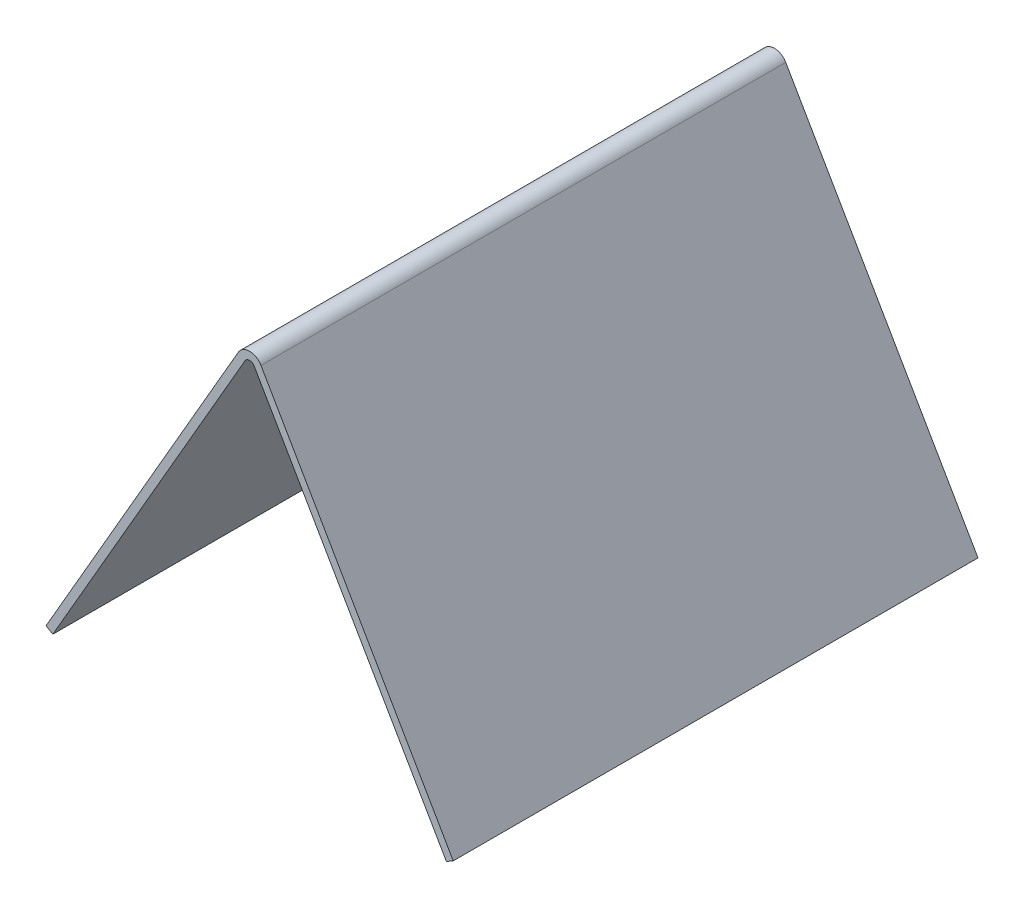
ISO-10303-21;
HEADER;
FILE_DESCRIPTION(('STEP AP214'),'2;1');
FILE_NAME('part.step','',(''),(''),'','','');
FILE_SCHEMA(('AUTOMOTIVE_DESIGN { 1 0 10303 214 1 1 1 1 }'));
ENDSEC;
DATA;
#1=APPLICATION_CONTEXT('core data for automotive mechanical design processes');
#2=APPLICATION_PROTOCOL_DEFINITION('international standard','automotive_design',2000,#1);
#3=PRODUCT_CONTEXT('',#1,'mechanical');
#4=PRODUCT('Part','Part','',(#3));
#5=PRODUCT_RELATED_PRODUCT_CATEGORY('part','',(#4));
#6=PRODUCT_DEFINITION_FORMATION('','',#4);
#7=PRODUCT_DEFINITION_CONTEXT('part definition',#1,'design');
#8=PRODUCT_DEFINITION('design','',#6,#7);
#9=PRODUCT_DEFINITION_SHAPE('','',#8);
#10=(LENGTH_UNIT() NAMED_UNIT(*) SI_UNIT(.MILLI.,.METRE.));
#11=(NAMED_UNIT(*) PLANE_ANGLE_UNIT() SI_UNIT($,.RADIAN.));
#12=(NAMED_UNIT(*) SI_UNIT($,.STERADIAN.) SOLID_ANGLE_UNIT());
#13=UNCERTAINTY_MEASURE_WITH_UNIT(LENGTH_MEASURE(1.E-05),#10,'distance_accuracy_value','');
#14=(GEOMETRIC_REPRESENTATION_CONTEXT(3) GLOBAL_UNCERTAINTY_ASSIGNED_CONTEXT((#13)) GLOBAL_UNIT_ASSIGNED_CONTEXT((#10,
#11,#12)) REPRESENTATION_CONTEXT('',''));
#15=CARTESIAN_POINT('',(0.,0.,0.));
#16=DIRECTION('',(0.,0.,1.));
#17=DIRECTION('',(1.,0.,0.));
#18=AXIS2_PLACEMENT_3D('',#15,#16,#17);
#19=CARTESIAN_POINT('',(-75.,0.,200.));
#20=DIRECTION('',(0.500000000000005,0.866025403784436,0.));
#21=DIRECTION('',(-0.866025403784436,0.500000000000005,0.));
#22=AXIS2_PLACEMENT_3D('',#19,#20,#21);
#23=PLANE('',#22);
#24=DIRECTION('',(0.866025403784436,-0.500000000000005,0.));
#25=VECTOR('',#24,1.);
#26=CARTESIAN_POINT('',(-75.,0.,0.));
#27=LINE('',#26,#25);
#28=CARTESIAN_POINT('',(-77.5980762113532,1.49999999999998,0.));
#29=VERTEX_POINT('',#28);
#30=CARTESIAN_POINT('',(-75.,0.,0.));
#31=VERTEX_POINT('',#30);
#32=EDGE_CURVE('E128',#29,#31,#27,.T.);
#33=ORIENTED_EDGE('',*,*,#32,.T.);
#34=DIRECTION('',(0.,0.,-1.));
#35=VECTOR('',#34,1.);
#36=CARTESIAN_POINT('',(-75.,0.,200.));
#37=LINE('',#36,#35);
#38=CARTESIAN_POINT('',(-75.,0.,200.));
#39=VERTEX_POINT('',#38);
#40=EDGE_CURVE('E11',#39,#31,#37,.T.);
#41=ORIENTED_EDGE('',*,*,#40,.F.);
#42=DIRECTION('',(0.866025403784436,-0.500000000000005,0.));
#43=VECTOR('',#42,1.);
#44=CARTESIAN_POINT('',(-75.,0.,200.));
#45=LINE('',#44,#43);
#46=CARTESIAN_POINT('',(-77.5980762113532,1.49999999999998,200.));
#47=VERTEX_POINT('',#46);
#48=EDGE_CURVE('E142',#47,#39,#45,.T.);
#49=ORIENTED_EDGE('',*,*,#48,.F.);
#50=DIRECTION('',(0.,0.,-1.));
#51=VECTOR('',#50,1.);
#52=CARTESIAN_POINT('',(-77.5980762113532,1.49999999999998,200.));
#53=LINE('',#52,#51);
#54=EDGE_CURVE('E124',#47,#29,#53,.T.);
#55=ORIENTED_EDGE('',*,*,#54,.T.);
#56=EDGE_LOOP('',(#33,#41,#49,#55));
#57=FACE_BOUND('',#56,.T.);
#58=ADVANCED_FACE('F32',(#57),#23,.F.);
#59=CARTESIAN_POINT('',(-1.73205080756889,126.903810567665,200.));
#60=DIRECTION('',(-0.866025403784438,0.500000000000001,0.));
#61=DIRECTION('',(-0.500000000000001,-0.866025403784438,0.));
#62=AXIS2_PLACEMENT_3D('',#59,#60,#61);
#63=PLANE('',#62);
#64=DIRECTION('',(0.500000000000001,0.866025403784438,0.));
#65=VECTOR('',#64,1.);
#66=CARTESIAN_POINT('',(-1.73205080756889,126.903810567665,0.));
#67=LINE('',#66,#65);
#68=CARTESIAN_POINT('',(-1.73205080756889,126.903810567665,0.));
#69=VERTEX_POINT('',#68);
#70=EDGE_CURVE('E131',#31,#69,#67,.T.);
#71=ORIENTED_EDGE('',*,*,#70,.T.);
#72=DIRECTION('',(0.,0.,-1.));
#73=VECTOR('',#72,1.);
#74=CARTESIAN_POINT('',(-1.73205080756889,126.903810567665,200.));
#75=LINE('',#74,#73);
#76=CARTESIAN_POINT('',(-1.73205080756889,126.903810567665,200.));
#77=VERTEX_POINT('',#76);
#78=EDGE_CURVE('E40',#77,#69,#75,.T.);
#79=ORIENTED_EDGE('',*,*,#78,.F.);
#80=DIRECTION('',(0.500000000000001,0.866025403784438,0.));
#81=VECTOR('',#80,1.);
#82=CARTESIAN_POINT('',(-1.73205080756889,126.903810567665,200.));
#83=LINE('',#82,#81);
#84=EDGE_CURVE('E91',#39,#77,#83,.T.);
#85=ORIENTED_EDGE('',*,*,#84,.F.);
#86=ORIENTED_EDGE('',*,*,#40,.T.);
#87=EDGE_LOOP('',(#71,#79,#85,#86));
#88=FACE_BOUND('',#87,.T.);
#89=ADVANCED_FACE('F177',(#88),#63,.F.);
#90=CARTESIAN_POINT('',(0.,125.903810567665,200.));
#91=DIRECTION('',(0.,0.,-1.));
#92=DIRECTION('',(-1.,0.,0.));
#93=AXIS2_PLACEMENT_3D('',#90,#91,#92);
#94=CYLINDRICAL_SURFACE('',#93,2.);
#95=CARTESIAN_POINT('',(0.,125.903810567665,0.));
#96=DIRECTION('',(0.,0.,-1.));
#97=DIRECTION('',(1.,0.,0.));
#98=AXIS2_PLACEMENT_3D('',#95,#96,#97);
#99=CIRCLE('',#98,2.);
#100=CARTESIAN_POINT('',(1.73205080756889,126.903810567665,0.));
#101=VERTEX_POINT('',#100);
#102=EDGE_CURVE('E133',#69,#101,#99,.T.);
#103=ORIENTED_EDGE('',*,*,#102,.T.);
#104=DIRECTION('',(0.,0.,-1.));
#105=VECTOR('',#104,1.);
#106=CARTESIAN_POINT('',(1.73205080756889,126.903810567665,200.));
#107=LINE('',#106,#105);
#108=CARTESIAN_POINT('',(1.73205080756889,126.903810567665,200.));
#109=VERTEX_POINT('',#108);
#110=EDGE_CURVE('E149',#109,#101,#107,.T.);
#111=ORIENTED_EDGE('',*,*,#110,.F.);
#112=CARTESIAN_POINT('',(0.,125.903810567665,200.));
#113=DIRECTION('',(0.,0.,-1.));
#114=DIRECTION('',(1.,0.,0.));
#115=AXIS2_PLACEMENT_3D('',#112,#113,#114);
#116=CIRCLE('',#115,2.);
#117=EDGE_CURVE('E157',#77,#109,#116,.T.);
#118=ORIENTED_EDGE('',*,*,#117,.F.);
#119=ORIENTED_EDGE('',*,*,#78,.T.);
#120=EDGE_LOOP('',(#103,#111,#118,#119));
#121=FACE_BOUND('',#120,.T.);
#122=ADVANCED_FACE('F155',(#121),#94,.F.);
#123=CARTESIAN_POINT('',(1.73205080756889,126.903810567665,200.));
#124=DIRECTION('',(0.866025403784438,0.500000000000001,0.));
#125=DIRECTION('',(-0.500000000000001,0.866025403784438,0.));
#126=AXIS2_PLACEMENT_3D('',#123,#124,#125);
#127=PLANE('',#126);
#128=DIRECTION('',(0.500000000000001,-0.866025403784438,0.));
#129=VECTOR('',#128,1.);
#130=CARTESIAN_POINT('',(1.73205080756889,126.903810567665,0.));
#131=LINE('',#130,#129);
#132=CARTESIAN_POINT('',(75.,0.,0.));
#133=VERTEX_POINT('',#132);
#134=EDGE_CURVE('E135',#101,#133,#131,.T.);
#135=ORIENTED_EDGE('',*,*,#134,.T.);
#136=DIRECTION('',(0.,0.,-1.));
#137=VECTOR('',#136,1.);
#138=CARTESIAN_POINT('',(75.,0.,200.));
#139=LINE('',#138,#137);
#140=CARTESIAN_POINT('',(75.,0.,200.));
#141=VERTEX_POINT('',#140);
#142=EDGE_CURVE('E146',#141,#133,#139,.T.);
#143=ORIENTED_EDGE('',*,*,#142,.F.);
#144=DIRECTION('',(0.500000000000001,-0.866025403784438,0.));
#145=VECTOR('',#144,1.);
#146=CARTESIAN_POINT('',(1.73205080756889,126.903810567665,200.));
#147=LINE('',#146,#145);
#148=EDGE_CURVE('E169',#109,#141,#147,.T.);
#149=ORIENTED_EDGE('',*,*,#148,.F.);
#150=ORIENTED_EDGE('',*,*,#110,.T.);
#151=EDGE_LOOP('',(#135,#143,#149,#150));
#152=FACE_BOUND('',#151,.T.);
#153=ADVANCED_FACE('F165',(#152),#127,.F.);
#154=CARTESIAN_POINT('',(75.,0.,200.));
#155=DIRECTION('',(-0.500000000000005,0.866025403784436,0.));
#156=DIRECTION('',(-0.866025403784436,-0.500000000000005,0.));
#157=AXIS2_PLACEMENT_3D('',#154,#155,#156);
#158=PLANE('',#157);
#159=DIRECTION('',(0.866025403784436,0.500000000000005,0.));
#160=VECTOR('',#159,1.);
#161=CARTESIAN_POINT('',(75.,0.,0.));
#162=LINE('',#161,#160);
#163=CARTESIAN_POINT('',(77.5980762113533,1.5,0.));
#164=VERTEX_POINT('',#163);
#165=EDGE_CURVE('E137',#133,#164,#162,.T.);
#166=ORIENTED_EDGE('',*,*,#165,.T.);
#167=DIRECTION('',(0.,0.,-1.));
#168=VECTOR('',#167,1.);
#169=CARTESIAN_POINT('',(77.5980762113533,1.5,200.));
#170=LINE('',#169,#168);
#171=CARTESIAN_POINT('',(77.5980762113533,1.5,200.));
#172=VERTEX_POINT('',#171);
#173=EDGE_CURVE('E119',#172,#164,#170,.T.);
#174=ORIENTED_EDGE('',*,*,#173,.F.);
#175=DIRECTION('',(0.866025403784436,0.500000000000005,0.));
#176=VECTOR('',#175,1.);
#177=CARTESIAN_POINT('',(75.,0.,200.));
#178=LINE('',#177,#176);
#179=EDGE_CURVE('E110',#141,#172,#178,.T.);
#180=ORIENTED_EDGE('',*,*,#179,.F.);
#181=ORIENTED_EDGE('',*,*,#142,.T.);
#182=EDGE_LOOP('',(#166,#174,#180,#181));
#183=FACE_BOUND('',#182,.T.);
#184=ADVANCED_FACE('F168',(#183),#158,.F.);
#185=CARTESIAN_POINT('',(77.5980762113533,1.5,200.));
#186=DIRECTION('',(-0.866025403784438,-0.500000000000001,0.));
#187=DIRECTION('',(0.500000000000001,-0.866025403784438,0.));
#188=AXIS2_PLACEMENT_3D('',#185,#186,#187);
#189=PLANE('',#188);
#190=DIRECTION('',(-0.500000000000001,0.866025403784438,0.));
#191=VECTOR('',#190,1.);
#192=CARTESIAN_POINT('',(77.5980762113533,1.5,0.));
#193=LINE('',#192,#191);
#194=CARTESIAN_POINT('',(4.3301270189222,128.403810567665,0.));
#195=VERTEX_POINT('',#194);
#196=EDGE_CURVE('E118',#164,#195,#193,.T.);
#197=ORIENTED_EDGE('',*,*,#196,.T.);
#198=DIRECTION('',(0.,0.,-1.));
#199=VECTOR('',#198,1.);
#200=CARTESIAN_POINT('',(4.3301270189222,128.403810567665,200.));
#201=LINE('',#200,#199);
#202=CARTESIAN_POINT('',(4.3301270189222,128.403810567665,200.));
#203=VERTEX_POINT('',#202);
#204=EDGE_CURVE('E115',#203,#195,#201,.T.);
#205=ORIENTED_EDGE('',*,*,#204,.F.);
#206=DIRECTION('',(-0.500000000000001,0.866025403784438,0.));
#207=VECTOR('',#206,1.);
#208=CARTESIAN_POINT('',(77.5980762113533,1.5,200.));
#209=LINE('',#208,#207);
#210=EDGE_CURVE('E104',#172,#203,#209,.T.);
#211=ORIENTED_EDGE('',*,*,#210,.F.);
#212=ORIENTED_EDGE('',*,*,#173,.T.);
#213=EDGE_LOOP('',(#197,#205,#211,#212));
#214=FACE_BOUND('',#213,.T.);
#215=ADVANCED_FACE('F116',(#214),#189,.F.);
#216=CARTESIAN_POINT('',(0.,125.903810567665,200.));
#217=DIRECTION('',(0.,0.,-1.));
#218=DIRECTION('',(-1.,0.,0.));
#219=AXIS2_PLACEMENT_3D('',#216,#217,#218);
#220=CYLINDRICAL_SURFACE('',#219,5.);
#221=CARTESIAN_POINT('',(0.,125.903810567665,0.));
#222=DIRECTION('',(0.,0.,1.));
#223=DIRECTION('',(1.,0.,0.));
#224=AXIS2_PLACEMENT_3D('',#221,#222,#223);
#225=CIRCLE('',#224,5.);
#226=CARTESIAN_POINT('',(-4.3301270189222,128.403810567665,0.));
#227=VERTEX_POINT('',#226);
#228=EDGE_CURVE('E77',#195,#227,#225,.T.);
#229=ORIENTED_EDGE('',*,*,#228,.T.);
#230=DIRECTION('',(0.,0.,-1.));
#231=VECTOR('',#230,1.);
#232=CARTESIAN_POINT('',(-4.3301270189222,128.403810567665,200.));
#233=LINE('',#232,#231);
#234=CARTESIAN_POINT('',(-4.3301270189222,128.403810567665,200.));
#235=VERTEX_POINT('',#234);
#236=EDGE_CURVE('E120',#235,#227,#233,.T.);
#237=ORIENTED_EDGE('',*,*,#236,.F.);
#238=CARTESIAN_POINT('',(0.,125.903810567665,200.));
#239=DIRECTION('',(0.,0.,1.));
#240=DIRECTION('',(1.,0.,0.));
#241=AXIS2_PLACEMENT_3D('',#238,#239,#240);
#242=CIRCLE('',#241,5.);
#243=EDGE_CURVE('E108',#203,#235,#242,.T.);
#244=ORIENTED_EDGE('',*,*,#243,.F.);
#245=ORIENTED_EDGE('',*,*,#204,.T.);
#246=EDGE_LOOP('',(#229,#237,#244,#245));
#247=FACE_BOUND('',#246,.T.);
#248=ADVANCED_FACE('F122',(#247),#220,.T.);
#249=CARTESIAN_POINT('',(-77.5980762113532,1.49999999999998,200.));
#250=DIRECTION('',(0.866025403784438,-0.500000000000001,0.));
#251=DIRECTION('',(0.500000000000001,0.866025403784438,0.));
#252=AXIS2_PLACEMENT_3D('',#249,#250,#251);
#253=PLANE('',#252);
#254=DIRECTION('',(-0.500000000000001,-0.866025403784438,0.));
#255=VECTOR('',#254,1.);
#256=CARTESIAN_POINT('',(-77.5980762113532,1.49999999999998,0.));
#257=LINE('',#256,#255);
#258=EDGE_CURVE('E83',#227,#29,#257,.T.);
#259=ORIENTED_EDGE('',*,*,#258,.T.);
#260=ORIENTED_EDGE('',*,*,#54,.F.);
#261=DIRECTION('',(-0.500000000000001,-0.866025403784438,0.));
#262=VECTOR('',#261,1.);
#263=CARTESIAN_POINT('',(-77.5980762113532,1.49999999999998,200.));
#264=LINE('',#263,#262);
#265=EDGE_CURVE('E48',#235,#47,#264,.T.);
#266=ORIENTED_EDGE('',*,*,#265,.F.);
#267=ORIENTED_EDGE('',*,*,#236,.T.);
#268=EDGE_LOOP('',(#259,#260,#266,#267));
#269=FACE_BOUND('',#268,.T.);
#270=ADVANCED_FACE('F193',(#269),#253,.F.);
#271=CARTESIAN_POINT('',(0.,125.903810567665,200.));
#272=DIRECTION('',(0.,0.,1.));
#273=DIRECTION('',(1.,0.,0.));
#274=AXIS2_PLACEMENT_3D('',#271,#272,#273);
#275=PLANE('',#274);
#276=ORIENTED_EDGE('',*,*,#48,.T.);
#277=ORIENTED_EDGE('',*,*,#84,.T.);
#278=ORIENTED_EDGE('',*,*,#117,.T.);
#279=ORIENTED_EDGE('',*,*,#148,.T.);
#280=ORIENTED_EDGE('',*,*,#179,.T.);
#281=ORIENTED_EDGE('',*,*,#210,.T.);
#282=ORIENTED_EDGE('',*,*,#243,.T.);
#283=ORIENTED_EDGE('',*,*,#265,.T.);
#284=EDGE_LOOP('',(#276,#277,#278,#279,#280,#281,#282,#283));
#285=FACE_BOUND('',#284,.T.);
#286=ADVANCED_FACE('F106',(#285),#275,.T.);
#287=CARTESIAN_POINT('',(0.,125.903810567665,0.));
#288=DIRECTION('',(0.,0.,1.));
#289=DIRECTION('',(1.,0.,0.));
#290=AXIS2_PLACEMENT_3D('',#287,#288,#289);
#291=PLANE('',#290);
#292=ORIENTED_EDGE('',*,*,#32,.F.);
#293=ORIENTED_EDGE('',*,*,#258,.F.);
#294=ORIENTED_EDGE('',*,*,#228,.F.);
#295=ORIENTED_EDGE('',*,*,#196,.F.);
#296=ORIENTED_EDGE('',*,*,#165,.F.);
#297=ORIENTED_EDGE('',*,*,#134,.F.);
#298=ORIENTED_EDGE('',*,*,#102,.F.);
#299=ORIENTED_EDGE('',*,*,#70,.F.);
#300=EDGE_LOOP('',(#292,#293,#294,#295,#296,#297,#298,#299));
#301=FACE_BOUND('',#300,.T.);
#302=ADVANCED_FACE('F161',(#301),#291,.F.);
#303=CLOSED_SHELL('',(#58,#89,#122,#153,#184,#215,#248,#270,#286,#302));
#304=MANIFOLD_SOLID_BREP('B2',#303);
#305=ADVANCED_BREP_SHAPE_REPRESENTATION('',(#18,#304),#14);
#306=SHAPE_DEFINITION_REPRESENTATION(#9,#305);
ENDSEC;
END-ISO-10303-21;
